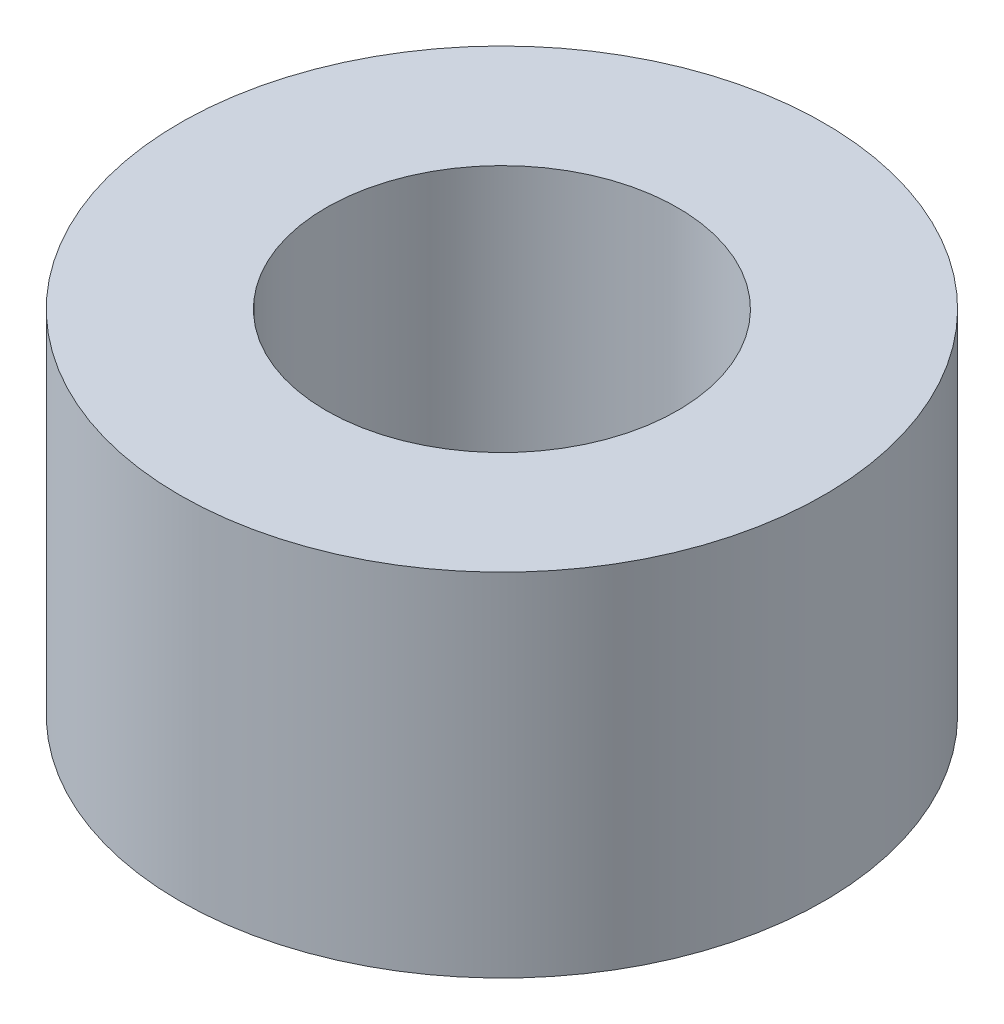
ISO-10303-21;
HEADER;
FILE_DESCRIPTION(('STEP AP214'),'2;1');
FILE_NAME('part.step','',(''),(''),'','','');
FILE_SCHEMA(('AUTOMOTIVE_DESIGN { 1 0 10303 214 1 1 1 1 }'));
ENDSEC;
DATA;
#1=APPLICATION_CONTEXT('core data for automotive mechanical design processes');
#2=APPLICATION_PROTOCOL_DEFINITION('international standard','automotive_design',2000,#1);
#3=PRODUCT_CONTEXT('',#1,'mechanical');
#4=PRODUCT('Part','Part','',(#3));
#5=PRODUCT_RELATED_PRODUCT_CATEGORY('part','',(#4));
#6=PRODUCT_DEFINITION_FORMATION('','',#4);
#7=PRODUCT_DEFINITION_CONTEXT('part definition',#1,'design');
#8=PRODUCT_DEFINITION('design','',#6,#7);
#9=PRODUCT_DEFINITION_SHAPE('','',#8);
#10=(LENGTH_UNIT() NAMED_UNIT(*) SI_UNIT(.MILLI.,.METRE.));
#11=(NAMED_UNIT(*) PLANE_ANGLE_UNIT() SI_UNIT($,.RADIAN.));
#12=(NAMED_UNIT(*) SI_UNIT($,.STERADIAN.) SOLID_ANGLE_UNIT());
#13=UNCERTAINTY_MEASURE_WITH_UNIT(LENGTH_MEASURE(1.E-05),#10,'distance_accuracy_value','');
#14=(GEOMETRIC_REPRESENTATION_CONTEXT(3) GLOBAL_UNCERTAINTY_ASSIGNED_CONTEXT((#13)) GLOBAL_UNIT_ASSIGNED_CONTEXT((#10,
#11,#12)) REPRESENTATION_CONTEXT('',''));
#15=CARTESIAN_POINT('',(0.,0.,0.));
#16=DIRECTION('',(0.,0.,1.));
#17=DIRECTION('',(1.,0.,0.));
#18=AXIS2_PLACEMENT_3D('',#15,#16,#17);
#19=CARTESIAN_POINT('',(0.,6.,0.));
#20=DIRECTION('',(0.,1.,0.));
#21=DIRECTION('',(0.,0.,1.));
#22=AXIS2_PLACEMENT_3D('',#19,#20,#21);
#23=PLANE('',#22);
#24=CARTESIAN_POINT('',(0.,6.,0.));
#25=DIRECTION('',(0.,1.,0.));
#26=DIRECTION('',(0.,0.,1.));
#27=AXIS2_PLACEMENT_3D('',#24,#25,#26);
#28=CIRCLE('',#27,5.5);
#29=CARTESIAN_POINT('',(0.,6.,5.5));
#30=VERTEX_POINT('',#29);
#31=EDGE_CURVE('E10',#30,#30,#28,.T.);
#32=ORIENTED_EDGE('',*,*,#31,.T.);
#33=EDGE_LOOP('',(#32));
#34=FACE_BOUND('',#33,.T.);
#35=CARTESIAN_POINT('',(0.,6.,0.));
#36=DIRECTION('',(0.,1.,0.));
#37=DIRECTION('',(0.,0.,1.));
#38=AXIS2_PLACEMENT_3D('',#35,#36,#37);
#39=CIRCLE('',#38,3.);
#40=CARTESIAN_POINT('',(0.,6.,3.));
#41=VERTEX_POINT('',#40);
#42=EDGE_CURVE('E42',#41,#41,#39,.T.);
#43=ORIENTED_EDGE('',*,*,#42,.F.);
#44=EDGE_LOOP('',(#43));
#45=FACE_BOUND('',#44,.T.);
#46=ADVANCED_FACE('F31',(#34,#45),#23,.T.);
#47=CARTESIAN_POINT('',(0.,0.,0.));
#48=DIRECTION('',(0.,1.,0.));
#49=DIRECTION('',(0.,0.,1.));
#50=AXIS2_PLACEMENT_3D('',#47,#48,#49);
#51=PLANE('',#50);
#52=CARTESIAN_POINT('',(0.,0.,0.));
#53=DIRECTION('',(0.,1.,0.));
#54=DIRECTION('',(0.,0.,1.));
#55=AXIS2_PLACEMENT_3D('',#52,#53,#54);
#56=CIRCLE('',#55,5.5);
#57=CARTESIAN_POINT('',(0.,0.,5.5));
#58=VERTEX_POINT('',#57);
#59=EDGE_CURVE('E35',#58,#58,#56,.T.);
#60=ORIENTED_EDGE('',*,*,#59,.F.);
#61=EDGE_LOOP('',(#60));
#62=FACE_BOUND('',#61,.T.);
#63=CARTESIAN_POINT('',(0.,0.,0.));
#64=DIRECTION('',(0.,1.,0.));
#65=DIRECTION('',(0.,0.,1.));
#66=AXIS2_PLACEMENT_3D('',#63,#64,#65);
#67=CIRCLE('',#66,3.);
#68=CARTESIAN_POINT('',(0.,0.,3.));
#69=VERTEX_POINT('',#68);
#70=EDGE_CURVE('E44',#69,#69,#67,.T.);
#71=ORIENTED_EDGE('',*,*,#70,.T.);
#72=EDGE_LOOP('',(#71));
#73=FACE_BOUND('',#72,.T.);
#74=ADVANCED_FACE('F54',(#62,#73),#51,.F.);
#75=CARTESIAN_POINT('',(0.,6.,0.));
#76=DIRECTION('',(0.,-1.,0.));
#77=DIRECTION('',(0.,0.,-1.));
#78=AXIS2_PLACEMENT_3D('',#75,#76,#77);
#79=CYLINDRICAL_SURFACE('',#78,5.5);
#80=ORIENTED_EDGE('',*,*,#31,.F.);
#81=EDGE_LOOP('',(#80));
#82=FACE_BOUND('',#81,.T.);
#83=ORIENTED_EDGE('',*,*,#59,.T.);
#84=EDGE_LOOP('',(#83));
#85=FACE_BOUND('',#84,.T.);
#86=ADVANCED_FACE('F33',(#82,#85),#79,.T.);
#87=CARTESIAN_POINT('',(0.,6.,0.));
#88=DIRECTION('',(0.,-1.,0.));
#89=DIRECTION('',(0.,0.,-1.));
#90=AXIS2_PLACEMENT_3D('',#87,#88,#89);
#91=CYLINDRICAL_SURFACE('',#90,3.);
#92=ORIENTED_EDGE('',*,*,#42,.T.);
#93=EDGE_LOOP('',(#92));
#94=FACE_BOUND('',#93,.T.);
#95=ORIENTED_EDGE('',*,*,#70,.F.);
#96=EDGE_LOOP('',(#95));
#97=FACE_BOUND('',#96,.T.);
#98=ADVANCED_FACE('F50',(#94,#97),#91,.F.);
#99=CLOSED_SHELL('',(#46,#74,#86,#98));
#100=MANIFOLD_SOLID_BREP('B2',#99);
#101=ADVANCED_BREP_SHAPE_REPRESENTATION('',(#18,#100),#14);
#102=SHAPE_DEFINITION_REPRESENTATION(#9,#101);
ENDSEC;
END-ISO-10303-21;
